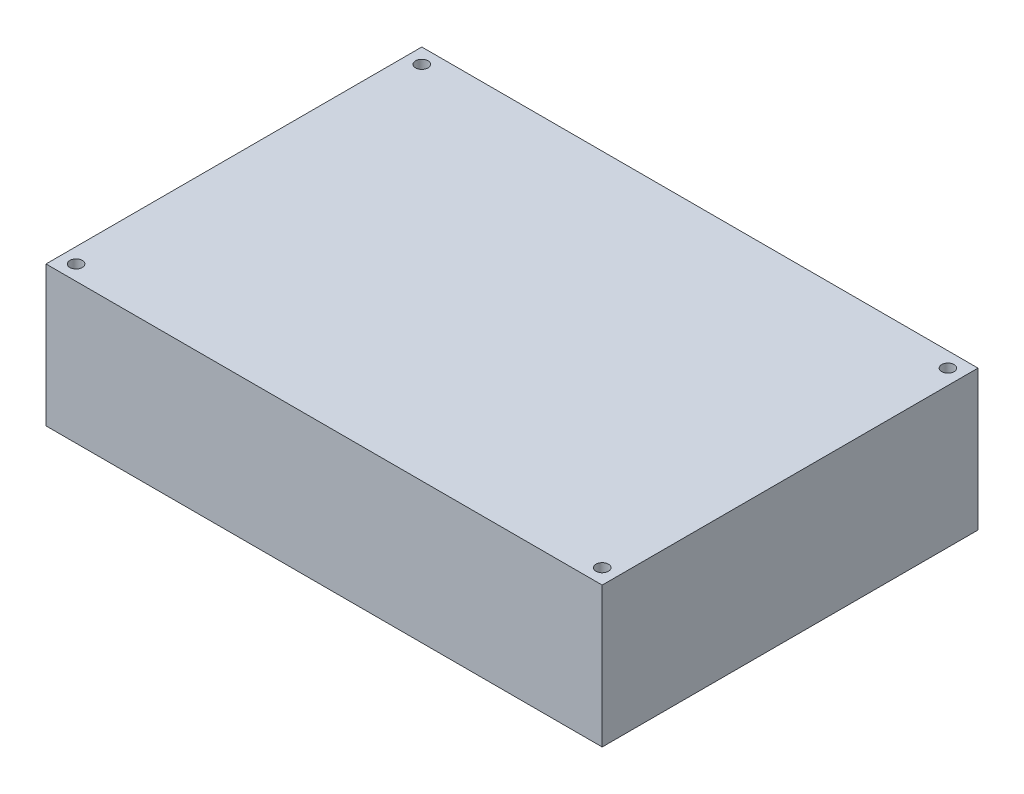
ISO-10303-21;
HEADER;
FILE_DESCRIPTION(('STEP AP214'),'2;1');
FILE_NAME('part.step','',(''),(''),'','','');
FILE_SCHEMA(('AUTOMOTIVE_DESIGN { 1 0 10303 214 1 1 1 1 }'));
ENDSEC;
DATA;
#1=APPLICATION_CONTEXT('core data for automotive mechanical design processes');
#2=APPLICATION_PROTOCOL_DEFINITION('international standard','automotive_design',2000,#1);
#3=PRODUCT_CONTEXT('',#1,'mechanical');
#4=PRODUCT('Part','Part','',(#3));
#5=PRODUCT_RELATED_PRODUCT_CATEGORY('part','',(#4));
#6=PRODUCT_DEFINITION_FORMATION('','',#4);
#7=PRODUCT_DEFINITION_CONTEXT('part definition',#1,'design');
#8=PRODUCT_DEFINITION('design','',#6,#7);
#9=PRODUCT_DEFINITION_SHAPE('','',#8);
#10=(LENGTH_UNIT() NAMED_UNIT(*) SI_UNIT(.MILLI.,.METRE.));
#11=(NAMED_UNIT(*) PLANE_ANGLE_UNIT() SI_UNIT($,.RADIAN.));
#12=(NAMED_UNIT(*) SI_UNIT($,.STERADIAN.) SOLID_ANGLE_UNIT());
#13=UNCERTAINTY_MEASURE_WITH_UNIT(LENGTH_MEASURE(1.E-05),#10,'distance_accuracy_value','');
#14=(GEOMETRIC_REPRESENTATION_CONTEXT(3) GLOBAL_UNCERTAINTY_ASSIGNED_CONTEXT((#13)) GLOBAL_UNIT_ASSIGNED_CONTEXT((#10,
#11,#12)) REPRESENTATION_CONTEXT('',''));
#15=CARTESIAN_POINT('',(0.,0.,0.));
#16=DIRECTION('',(0.,0.,1.));
#17=DIRECTION('',(1.,0.,0.));
#18=AXIS2_PLACEMENT_3D('',#15,#16,#17);
#19=CARTESIAN_POINT('',(0.,0.,0.));
#20=DIRECTION('',(0.,-1.,0.));
#21=DIRECTION('',(0.,0.,-1.));
#22=AXIS2_PLACEMENT_3D('',#19,#20,#21);
#23=PLANE('',#22);
#24=CARTESIAN_POINT('',(44.45,0.,29.21));
#25=DIRECTION('',(0.,1.,0.));
#26=DIRECTION('',(0.,0.,1.));
#27=AXIS2_PLACEMENT_3D('',#24,#25,#26);
#28=CIRCLE('',#27,1.05);
#29=CARTESIAN_POINT('',(44.45,0.,30.26));
#30=VERTEX_POINT('',#29);
#31=EDGE_CURVE('E168',#30,#30,#28,.T.);
#32=ORIENTED_EDGE('',*,*,#31,.T.);
#33=EDGE_LOOP('',(#32));
#34=FACE_BOUND('',#33,.T.);
#35=CARTESIAN_POINT('',(-44.45,0.,-29.21));
#36=DIRECTION('',(0.,1.,0.));
#37=DIRECTION('',(0.,0.,1.));
#38=AXIS2_PLACEMENT_3D('',#35,#36,#37);
#39=CIRCLE('',#38,1.05);
#40=CARTESIAN_POINT('',(-44.45,0.,-28.16));
#41=VERTEX_POINT('',#40);
#42=EDGE_CURVE('E174',#41,#41,#39,.T.);
#43=ORIENTED_EDGE('',*,*,#42,.T.);
#44=EDGE_LOOP('',(#43));
#45=FACE_BOUND('',#44,.T.);
#46=DIRECTION('',(0.,0.,-1.));
#47=VECTOR('',#46,1.);
#48=CARTESIAN_POINT('',(-46.99,0.,31.75));
#49=LINE('',#48,#47);
#50=CARTESIAN_POINT('',(-46.99,0.,31.75));
#51=VERTEX_POINT('',#50);
#52=CARTESIAN_POINT('',(-46.99,0.,-31.75));
#53=VERTEX_POINT('',#52);
#54=EDGE_CURVE('E177',#51,#53,#49,.T.);
#55=ORIENTED_EDGE('',*,*,#54,.T.);
#56=DIRECTION('',(1.,0.,0.));
#57=VECTOR('',#56,1.);
#58=CARTESIAN_POINT('',(-46.99,0.,-31.75));
#59=LINE('',#58,#57);
#60=CARTESIAN_POINT('',(46.99,0.,-31.75));
#61=VERTEX_POINT('',#60);
#62=EDGE_CURVE('E180',#53,#61,#59,.T.);
#63=ORIENTED_EDGE('',*,*,#62,.T.);
#64=DIRECTION('',(0.,0.,-1.));
#65=VECTOR('',#64,1.);
#66=CARTESIAN_POINT('',(46.99,0.,31.75));
#67=LINE('',#66,#65);
#68=CARTESIAN_POINT('',(46.99,0.,31.75));
#69=VERTEX_POINT('',#68);
#70=EDGE_CURVE('E183',#69,#61,#67,.T.);
#71=ORIENTED_EDGE('',*,*,#70,.F.);
#72=DIRECTION('',(1.,0.,0.));
#73=VECTOR('',#72,1.);
#74=CARTESIAN_POINT('',(-46.99,0.,31.75));
#75=LINE('',#74,#73);
#76=EDGE_CURVE('E118',#51,#69,#75,.T.);
#77=ORIENTED_EDGE('',*,*,#76,.F.);
#78=EDGE_LOOP('',(#55,#63,#71,#77));
#79=FACE_BOUND('',#78,.T.);
#80=CARTESIAN_POINT('',(44.45,0.,-29.21));
#81=DIRECTION('',(0.,1.,0.));
#82=DIRECTION('',(0.,0.,1.));
#83=AXIS2_PLACEMENT_3D('',#80,#81,#82);
#84=CIRCLE('',#83,1.05);
#85=CARTESIAN_POINT('',(44.45,0.,-28.16));
#86=VERTEX_POINT('',#85);
#87=EDGE_CURVE('E171',#86,#86,#84,.T.);
#88=ORIENTED_EDGE('',*,*,#87,.T.);
#89=EDGE_LOOP('',(#88));
#90=FACE_BOUND('',#89,.T.);
#91=CARTESIAN_POINT('',(-44.45,0.,29.21));
#92=DIRECTION('',(0.,1.,0.));
#93=DIRECTION('',(0.,0.,1.));
#94=AXIS2_PLACEMENT_3D('',#91,#92,#93);
#95=CIRCLE('',#94,1.05);
#96=CARTESIAN_POINT('',(-44.45,0.,30.26));
#97=VERTEX_POINT('',#96);
#98=EDGE_CURVE('E165',#97,#97,#95,.T.);
#99=ORIENTED_EDGE('',*,*,#98,.T.);
#100=EDGE_LOOP('',(#99));
#101=FACE_BOUND('',#100,.T.);
#102=ADVANCED_FACE('F99',(#34,#45,#79,#90,#101),#23,.T.);
#103=CARTESIAN_POINT('',(-46.99,1.7,31.75));
#104=DIRECTION('',(-1.,0.,0.));
#105=DIRECTION('',(0.,0.,1.));
#106=AXIS2_PLACEMENT_3D('',#103,#104,#105);
#107=PLANE('',#106);
#108=ORIENTED_EDGE('',*,*,#54,.F.);
#109=DIRECTION('',(0.,-1.,0.));
#110=VECTOR('',#109,1.);
#111=CARTESIAN_POINT('',(-46.99,1.7,31.75));
#112=LINE('',#111,#110);
#113=CARTESIAN_POINT('',(-46.99,23.7,31.75));
#114=VERTEX_POINT('',#113);
#115=EDGE_CURVE('E12',#114,#51,#112,.T.);
#116=ORIENTED_EDGE('',*,*,#115,.F.);
#117=DIRECTION('',(0.,0.,1.));
#118=VECTOR('',#117,1.);
#119=CARTESIAN_POINT('',(-46.99,23.7,0.));
#120=LINE('',#119,#118);
#121=CARTESIAN_POINT('',(-46.99,23.7,-31.75));
#122=VERTEX_POINT('',#121);
#123=EDGE_CURVE('E155',#122,#114,#120,.T.);
#124=ORIENTED_EDGE('',*,*,#123,.F.);
#125=DIRECTION('',(0.,-1.,0.));
#126=VECTOR('',#125,1.);
#127=CARTESIAN_POINT('',(-46.99,1.7,-31.75));
#128=LINE('',#127,#126);
#129=EDGE_CURVE('E103',#122,#53,#128,.T.);
#130=ORIENTED_EDGE('',*,*,#129,.T.);
#131=EDGE_LOOP('',(#108,#116,#124,#130));
#132=FACE_BOUND('',#131,.T.);
#133=ADVANCED_FACE('F101',(#132),#107,.T.);
#134=CARTESIAN_POINT('',(-46.99,1.7,31.75));
#135=DIRECTION('',(0.,0.,-1.));
#136=DIRECTION('',(-1.,0.,0.));
#137=AXIS2_PLACEMENT_3D('',#134,#135,#136);
#138=PLANE('',#137);
#139=ORIENTED_EDGE('',*,*,#76,.T.);
#140=DIRECTION('',(0.,-1.,0.));
#141=VECTOR('',#140,1.);
#142=CARTESIAN_POINT('',(46.99,1.7,31.75));
#143=LINE('',#142,#141);
#144=CARTESIAN_POINT('',(46.99,23.7,31.75));
#145=VERTEX_POINT('',#144);
#146=EDGE_CURVE('E108',#145,#69,#143,.T.);
#147=ORIENTED_EDGE('',*,*,#146,.F.);
#148=DIRECTION('',(1.,0.,0.));
#149=VECTOR('',#148,1.);
#150=CARTESIAN_POINT('',(0.,23.7,31.75));
#151=LINE('',#150,#149);
#152=EDGE_CURVE('E138',#114,#145,#151,.T.);
#153=ORIENTED_EDGE('',*,*,#152,.F.);
#154=ORIENTED_EDGE('',*,*,#115,.T.);
#155=EDGE_LOOP('',(#139,#147,#153,#154));
#156=FACE_BOUND('',#155,.T.);
#157=ADVANCED_FACE('F136',(#156),#138,.F.);
#158=CARTESIAN_POINT('',(46.99,1.7,31.75));
#159=DIRECTION('',(-1.,0.,0.));
#160=DIRECTION('',(0.,0.,1.));
#161=AXIS2_PLACEMENT_3D('',#158,#159,#160);
#162=PLANE('',#161);
#163=ORIENTED_EDGE('',*,*,#70,.T.);
#164=DIRECTION('',(0.,-1.,0.));
#165=VECTOR('',#164,1.);
#166=CARTESIAN_POINT('',(46.99,1.7,-31.75));
#167=LINE('',#166,#165);
#168=CARTESIAN_POINT('',(46.99,23.7,-31.75));
#169=VERTEX_POINT('',#168);
#170=EDGE_CURVE('E142',#169,#61,#167,.T.);
#171=ORIENTED_EDGE('',*,*,#170,.F.);
#172=DIRECTION('',(0.,0.,-1.));
#173=VECTOR('',#172,1.);
#174=CARTESIAN_POINT('',(46.99,23.7,0.));
#175=LINE('',#174,#173);
#176=EDGE_CURVE('E145',#145,#169,#175,.T.);
#177=ORIENTED_EDGE('',*,*,#176,.F.);
#178=ORIENTED_EDGE('',*,*,#146,.T.);
#179=EDGE_LOOP('',(#163,#171,#177,#178));
#180=FACE_BOUND('',#179,.T.);
#181=ADVANCED_FACE('F146',(#180),#162,.F.);
#182=CARTESIAN_POINT('',(-46.99,1.7,-31.75));
#183=DIRECTION('',(0.,0.,-1.));
#184=DIRECTION('',(-1.,0.,0.));
#185=AXIS2_PLACEMENT_3D('',#182,#183,#184);
#186=PLANE('',#185);
#187=ORIENTED_EDGE('',*,*,#62,.F.);
#188=ORIENTED_EDGE('',*,*,#129,.F.);
#189=DIRECTION('',(-1.,0.,0.));
#190=VECTOR('',#189,1.);
#191=CARTESIAN_POINT('',(0.,23.7,-31.75));
#192=LINE('',#191,#190);
#193=EDGE_CURVE('E150',#169,#122,#192,.T.);
#194=ORIENTED_EDGE('',*,*,#193,.F.);
#195=ORIENTED_EDGE('',*,*,#170,.T.);
#196=EDGE_LOOP('',(#187,#188,#194,#195));
#197=FACE_BOUND('',#196,.T.);
#198=ADVANCED_FACE('F189',(#197),#186,.T.);
#199=CARTESIAN_POINT('',(-44.45,1.7,-29.21));
#200=DIRECTION('',(0.,-1.,0.));
#201=DIRECTION('',(0.,0.,-1.));
#202=AXIS2_PLACEMENT_3D('',#199,#200,#201);
#203=CYLINDRICAL_SURFACE('',#202,1.05);
#204=ORIENTED_EDGE('',*,*,#42,.F.);
#205=EDGE_LOOP('',(#204));
#206=FACE_BOUND('',#205,.T.);
#207=CARTESIAN_POINT('',(-44.45,23.7,-29.21));
#208=DIRECTION('',(0.,-1.,0.));
#209=DIRECTION('',(0.,0.,-1.));
#210=AXIS2_PLACEMENT_3D('',#207,#208,#209);
#211=CIRCLE('',#210,1.05);
#212=CARTESIAN_POINT('',(-44.45,23.7,-30.26));
#213=VERTEX_POINT('',#212);
#214=EDGE_CURVE('E156',#213,#213,#211,.T.);
#215=ORIENTED_EDGE('',*,*,#214,.F.);
#216=EDGE_LOOP('',(#215));
#217=FACE_BOUND('',#216,.T.);
#218=ADVANCED_FACE('F224',(#206,#217),#203,.F.);
#219=CARTESIAN_POINT('',(44.45,1.7,-29.21));
#220=DIRECTION('',(0.,-1.,0.));
#221=DIRECTION('',(0.,0.,-1.));
#222=AXIS2_PLACEMENT_3D('',#219,#220,#221);
#223=CYLINDRICAL_SURFACE('',#222,1.05);
#224=ORIENTED_EDGE('',*,*,#87,.F.);
#225=EDGE_LOOP('',(#224));
#226=FACE_BOUND('',#225,.T.);
#227=CARTESIAN_POINT('',(44.45,23.7,-29.21));
#228=DIRECTION('',(0.,-1.,0.));
#229=DIRECTION('',(0.,0.,-1.));
#230=AXIS2_PLACEMENT_3D('',#227,#228,#229);
#231=CIRCLE('',#230,1.05);
#232=CARTESIAN_POINT('',(44.45,23.7,-30.26));
#233=VERTEX_POINT('',#232);
#234=EDGE_CURVE('E207',#233,#233,#231,.T.);
#235=ORIENTED_EDGE('',*,*,#234,.F.);
#236=EDGE_LOOP('',(#235));
#237=FACE_BOUND('',#236,.T.);
#238=ADVANCED_FACE('F218',(#226,#237),#223,.F.);
#239=CARTESIAN_POINT('',(44.45,1.7,29.21));
#240=DIRECTION('',(0.,-1.,0.));
#241=DIRECTION('',(0.,0.,-1.));
#242=AXIS2_PLACEMENT_3D('',#239,#240,#241);
#243=CYLINDRICAL_SURFACE('',#242,1.05);
#244=ORIENTED_EDGE('',*,*,#31,.F.);
#245=EDGE_LOOP('',(#244));
#246=FACE_BOUND('',#245,.T.);
#247=CARTESIAN_POINT('',(44.45,23.7,29.21));
#248=DIRECTION('',(0.,-1.,0.));
#249=DIRECTION('',(0.,0.,-1.));
#250=AXIS2_PLACEMENT_3D('',#247,#248,#249);
#251=CIRCLE('',#250,1.05);
#252=CARTESIAN_POINT('',(44.45,23.7,28.16));
#253=VERTEX_POINT('',#252);
#254=EDGE_CURVE('E209',#253,#253,#251,.T.);
#255=ORIENTED_EDGE('',*,*,#254,.F.);
#256=EDGE_LOOP('',(#255));
#257=FACE_BOUND('',#256,.T.);
#258=ADVANCED_FACE('F202',(#246,#257),#243,.F.);
#259=CARTESIAN_POINT('',(-44.45,1.7,29.21));
#260=DIRECTION('',(0.,-1.,0.));
#261=DIRECTION('',(0.,0.,-1.));
#262=AXIS2_PLACEMENT_3D('',#259,#260,#261);
#263=CYLINDRICAL_SURFACE('',#262,1.05);
#264=ORIENTED_EDGE('',*,*,#98,.F.);
#265=EDGE_LOOP('',(#264));
#266=FACE_BOUND('',#265,.T.);
#267=CARTESIAN_POINT('',(-44.45,23.7,29.21));
#268=DIRECTION('',(0.,-1.,0.));
#269=DIRECTION('',(0.,0.,-1.));
#270=AXIS2_PLACEMENT_3D('',#267,#268,#269);
#271=CIRCLE('',#270,1.05);
#272=CARTESIAN_POINT('',(-44.45,23.7,28.16));
#273=VERTEX_POINT('',#272);
#274=EDGE_CURVE('E159',#273,#273,#271,.T.);
#275=ORIENTED_EDGE('',*,*,#274,.F.);
#276=EDGE_LOOP('',(#275));
#277=FACE_BOUND('',#276,.T.);
#278=ADVANCED_FACE('F199',(#266,#277),#263,.F.);
#279=CARTESIAN_POINT('',(0.,23.7,0.));
#280=DIRECTION('',(0.,1.,0.));
#281=DIRECTION('',(0.,0.,1.));
#282=AXIS2_PLACEMENT_3D('',#279,#280,#281);
#283=PLANE('',#282);
#284=ORIENTED_EDGE('',*,*,#254,.T.);
#285=EDGE_LOOP('',(#284));
#286=FACE_BOUND('',#285,.T.);
#287=ORIENTED_EDGE('',*,*,#234,.T.);
#288=EDGE_LOOP('',(#287));
#289=FACE_BOUND('',#288,.T.);
#290=ORIENTED_EDGE('',*,*,#274,.T.);
#291=EDGE_LOOP('',(#290));
#292=FACE_BOUND('',#291,.T.);
#293=ORIENTED_EDGE('',*,*,#214,.T.);
#294=EDGE_LOOP('',(#293));
#295=FACE_BOUND('',#294,.T.);
#296=ORIENTED_EDGE('',*,*,#152,.T.);
#297=ORIENTED_EDGE('',*,*,#176,.T.);
#298=ORIENTED_EDGE('',*,*,#193,.T.);
#299=ORIENTED_EDGE('',*,*,#123,.T.);
#300=EDGE_LOOP('',(#296,#297,#298,#299));
#301=FACE_BOUND('',#300,.T.);
#302=ADVANCED_FACE('F153',(#286,#289,#292,#295,#301),#283,.T.);
#303=CLOSED_SHELL('',(#102,#133,#157,#181,#198,#218,#238,#258,#278,#302));
#304=MANIFOLD_SOLID_BREP('B2',#303);
#305=ADVANCED_BREP_SHAPE_REPRESENTATION('',(#18,#304),#14);
#306=SHAPE_DEFINITION_REPRESENTATION(#9,#305);
ENDSEC;
END-ISO-10303-21;
